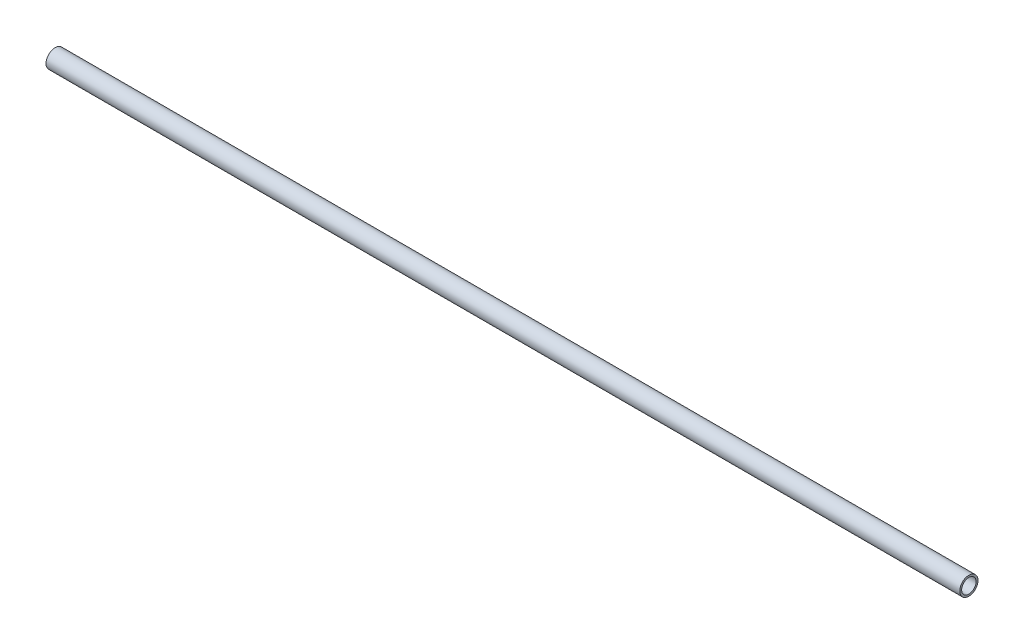
ISO-10303-21;
HEADER;
FILE_DESCRIPTION(('STEP AP214'),'2;1');
FILE_NAME('part.step','',(''),(''),'','','');
FILE_SCHEMA(('AUTOMOTIVE_DESIGN { 1 0 10303 214 1 1 1 1 }'));
ENDSEC;
DATA;
#1=APPLICATION_CONTEXT('core data for automotive mechanical design processes');
#2=APPLICATION_PROTOCOL_DEFINITION('international standard','automotive_design',2000,#1);
#3=PRODUCT_CONTEXT('',#1,'mechanical');
#4=PRODUCT('Part','Part','',(#3));
#5=PRODUCT_RELATED_PRODUCT_CATEGORY('part','',(#4));
#6=PRODUCT_DEFINITION_FORMATION('','',#4);
#7=PRODUCT_DEFINITION_CONTEXT('part definition',#1,'design');
#8=PRODUCT_DEFINITION('design','',#6,#7);
#9=PRODUCT_DEFINITION_SHAPE('','',#8);
#10=(LENGTH_UNIT() NAMED_UNIT(*) SI_UNIT(.MILLI.,.METRE.));
#11=(NAMED_UNIT(*) PLANE_ANGLE_UNIT() SI_UNIT($,.RADIAN.));
#12=(NAMED_UNIT(*) SI_UNIT($,.STERADIAN.) SOLID_ANGLE_UNIT());
#13=UNCERTAINTY_MEASURE_WITH_UNIT(LENGTH_MEASURE(1.E-05),#10,'distance_accuracy_value','');
#14=(GEOMETRIC_REPRESENTATION_CONTEXT(3) GLOBAL_UNCERTAINTY_ASSIGNED_CONTEXT((#13)) GLOBAL_UNIT_ASSIGNED_CONTEXT((#10,
#11,#12)) REPRESENTATION_CONTEXT('',''));
#15=CARTESIAN_POINT('',(0.,0.,0.));
#16=DIRECTION('',(0.,0.,1.));
#17=DIRECTION('',(1.,0.,0.));
#18=AXIS2_PLACEMENT_3D('',#15,#16,#17);
#19=CARTESIAN_POINT('',(1900.,0.,0.));
#20=DIRECTION('',(1.,0.,0.));
#21=DIRECTION('',(0.,0.,-1.));
#22=AXIS2_PLACEMENT_3D('',#19,#20,#21);
#23=PLANE('',#22);
#24=CARTESIAN_POINT('',(1900.,0.,0.));
#25=DIRECTION('',(1.,0.,0.));
#26=DIRECTION('',(0.,0.,-1.));
#27=AXIS2_PLACEMENT_3D('',#24,#25,#26);
#28=CIRCLE('',#27,19.);
#29=CARTESIAN_POINT('',(1900.,0.,19.));
#30=VERTEX_POINT('',#29);
#31=EDGE_CURVE('E10',#30,#30,#28,.T.);
#32=ORIENTED_EDGE('',*,*,#31,.T.);
#33=EDGE_LOOP('',(#32));
#34=FACE_BOUND('',#33,.T.);
#35=CARTESIAN_POINT('',(1900.,0.,0.));
#36=DIRECTION('',(1.,0.,0.));
#37=DIRECTION('',(0.,0.,-1.));
#38=AXIS2_PLACEMENT_3D('',#35,#36,#37);
#39=CIRCLE('',#38,15.);
#40=CARTESIAN_POINT('',(1900.,0.,15.));
#41=VERTEX_POINT('',#40);
#42=EDGE_CURVE('E41',#41,#41,#39,.T.);
#43=ORIENTED_EDGE('',*,*,#42,.F.);
#44=EDGE_LOOP('',(#43));
#45=FACE_BOUND('',#44,.T.);
#46=ADVANCED_FACE('F30',(#34,#45),#23,.T.);
#47=CARTESIAN_POINT('',(0.,0.,0.));
#48=DIRECTION('',(1.,0.,0.));
#49=DIRECTION('',(0.,0.,-1.));
#50=AXIS2_PLACEMENT_3D('',#47,#48,#49);
#51=PLANE('',#50);
#52=CARTESIAN_POINT('',(0.,0.,0.));
#53=DIRECTION('',(1.,0.,0.));
#54=DIRECTION('',(0.,0.,-1.));
#55=AXIS2_PLACEMENT_3D('',#52,#53,#54);
#56=CIRCLE('',#55,19.);
#57=CARTESIAN_POINT('',(-2.22044604925031E-13,0.,19.));
#58=VERTEX_POINT('',#57);
#59=EDGE_CURVE('E34',#58,#58,#56,.T.);
#60=ORIENTED_EDGE('',*,*,#59,.F.);
#61=EDGE_LOOP('',(#60));
#62=FACE_BOUND('',#61,.T.);
#63=CARTESIAN_POINT('',(0.,0.,0.));
#64=DIRECTION('',(1.,0.,0.));
#65=DIRECTION('',(0.,0.,-1.));
#66=AXIS2_PLACEMENT_3D('',#63,#64,#65);
#67=CIRCLE('',#66,15.);
#68=CARTESIAN_POINT('',(-2.22044604925031E-13,0.,15.));
#69=VERTEX_POINT('',#68);
#70=EDGE_CURVE('E43',#69,#69,#67,.T.);
#71=ORIENTED_EDGE('',*,*,#70,.T.);
#72=EDGE_LOOP('',(#71));
#73=FACE_BOUND('',#72,.T.);
#74=ADVANCED_FACE('F53',(#62,#73),#51,.F.);
#75=CARTESIAN_POINT('',(1900.,0.,0.));
#76=DIRECTION('',(-1.,0.,0.));
#77=DIRECTION('',(0.,0.,1.));
#78=AXIS2_PLACEMENT_3D('',#75,#76,#77);
#79=CYLINDRICAL_SURFACE('',#78,19.);
#80=CARTESIAN_POINT('',(1900.,0.,19.));
#81=CARTESIAN_POINT('',(1880.20833333333,0.,19.));
#82=CARTESIAN_POINT('',(1860.41666666667,0.,19.));
#83=CARTESIAN_POINT('',(1820.83333333333,0.,19.));
#84=CARTESIAN_POINT('',(1801.04166666667,0.,19.));
#85=CARTESIAN_POINT('',(1761.45833333333,0.,19.));
#86=CARTESIAN_POINT('',(1741.66666666667,0.,19.));
#87=CARTESIAN_POINT('',(1702.08333333333,0.,19.));
#88=CARTESIAN_POINT('',(1682.29166666667,0.,19.));
#89=CARTESIAN_POINT('',(1642.70833333333,0.,19.));
#90=CARTESIAN_POINT('',(1622.91666666667,0.,19.));
#91=CARTESIAN_POINT('',(1583.33333333333,0.,19.));
#92=CARTESIAN_POINT('',(1563.54166666667,0.,19.));
#93=CARTESIAN_POINT('',(1523.95833333333,0.,19.));
#94=CARTESIAN_POINT('',(1504.16666666667,0.,19.));
#95=CARTESIAN_POINT('',(1464.58333333333,0.,19.));
#96=CARTESIAN_POINT('',(1444.79166666667,0.,19.));
#97=CARTESIAN_POINT('',(1405.20833333333,0.,19.));
#98=CARTESIAN_POINT('',(1385.41666666667,0.,19.));
#99=CARTESIAN_POINT('',(1345.83333333333,0.,19.));
#100=CARTESIAN_POINT('',(1326.04166666667,0.,19.));
#101=CARTESIAN_POINT('',(1286.45833333333,0.,19.));
#102=CARTESIAN_POINT('',(1266.66666666667,0.,19.));
#103=CARTESIAN_POINT('',(1227.08333333333,0.,19.));
#104=CARTESIAN_POINT('',(1207.29166666667,0.,19.));
#105=CARTESIAN_POINT('',(1167.70833333333,0.,19.));
#106=CARTESIAN_POINT('',(1147.91666666667,0.,19.));
#107=CARTESIAN_POINT('',(1108.33333333333,0.,19.));
#108=CARTESIAN_POINT('',(1088.54166666667,0.,19.));
#109=CARTESIAN_POINT('',(1048.95833333333,0.,19.));
#110=CARTESIAN_POINT('',(1029.16666666667,0.,19.));
#111=CARTESIAN_POINT('',(989.583333333333,0.,19.));
#112=CARTESIAN_POINT('',(969.791666666666,0.,19.));
#113=CARTESIAN_POINT('',(930.208333333333,0.,19.));
#114=CARTESIAN_POINT('',(910.416666666667,0.,19.));
#115=CARTESIAN_POINT('',(870.833333333333,0.,19.));
#116=CARTESIAN_POINT('',(851.041666666667,0.,19.));
#117=CARTESIAN_POINT('',(811.458333333333,0.,19.));
#118=CARTESIAN_POINT('',(791.666666666667,0.,19.));
#119=CARTESIAN_POINT('',(752.083333333333,0.,19.));
#120=CARTESIAN_POINT('',(732.291666666667,0.,19.));
#121=CARTESIAN_POINT('',(692.708333333333,0.,19.));
#122=CARTESIAN_POINT('',(672.916666666667,0.,19.));
#123=CARTESIAN_POINT('',(633.333333333333,0.,19.));
#124=CARTESIAN_POINT('',(613.541666666667,0.,19.));
#125=CARTESIAN_POINT('',(573.958333333333,0.,19.));
#126=CARTESIAN_POINT('',(554.166666666667,0.,19.));
#127=CARTESIAN_POINT('',(514.583333333333,0.,19.));
#128=CARTESIAN_POINT('',(494.791666666667,0.,19.));
#129=CARTESIAN_POINT('',(455.208333333333,0.,19.));
#130=CARTESIAN_POINT('',(435.416666666667,0.,19.));
#131=CARTESIAN_POINT('',(395.833333333333,0.,19.));
#132=CARTESIAN_POINT('',(376.041666666667,0.,19.));
#133=CARTESIAN_POINT('',(336.458333333333,0.,19.));
#134=CARTESIAN_POINT('',(316.666666666666,0.,19.));
#135=CARTESIAN_POINT('',(277.083333333333,0.,19.));
#136=CARTESIAN_POINT('',(257.291666666666,0.,19.));
#137=CARTESIAN_POINT('',(217.708333333333,0.,19.));
#138=CARTESIAN_POINT('',(197.916666666667,0.,19.));
#139=CARTESIAN_POINT('',(158.333333333333,0.,19.));
#140=CARTESIAN_POINT('',(138.541666666666,0.,19.));
#141=CARTESIAN_POINT('',(98.958333333333,0.,19.));
#142=CARTESIAN_POINT('',(79.1666666666664,0.,19.));
#143=CARTESIAN_POINT('',(39.5833333333331,0.,19.));
#144=CARTESIAN_POINT('',(19.7916666666664,0.,19.));
#145=CARTESIAN_POINT('',(-2.22044604925031E-13,0.,19.));
#146=B_SPLINE_CURVE_WITH_KNOTS('',3,(#80,#81,#82,#83,#84,#85,#86,#87,#88,#89,#90,#91,#92,#93,
#94,#95,#96,#97,#98,#99,#100,#101,#102,#103,#104,#105,#106,#107,#108,#109,#110,#111,#112,#113,
#114,#115,#116,#117,#118,#119,#120,#121,#122,#123,#124,#125,#126,#127,#128,#129,#130,#131,#132,
#133,#134,#135,#136,#137,#138,#139,#140,#141,#142,#143,#144,#145),.UNSPECIFIED.,.F.,.F.,(4,2,2,
2,2,2,2,2,2,2,2,2,2,2,2,2,2,2,2,2,2,2,2,2,2,2,2,2,2,2,2,2,4),(0.,59.3750000000002,118.75,
178.125,237.5,296.875,356.25,415.625,475.,534.375,593.75,653.125,712.5,771.875,831.25,890.625,
950.,1009.375,1068.75,1128.125,1187.5,1246.875,1306.25,1365.625,1425.,1484.375,1543.75,1603.125,
1662.5,1721.875,1781.25,1840.625,1900.),.UNSPECIFIED.);
#147=EDGE_CURVE('BSEAM32',#30,#58,#146,.T.);
#148=ORIENTED_EDGE('',*,*,#31,.F.);
#149=ORIENTED_EDGE('',*,*,#59,.T.);
#150=ORIENTED_EDGE('',*,*,#147,.T.);
#151=ORIENTED_EDGE('',*,*,#147,.F.);
#152=EDGE_LOOP('',(#148,#150,#149,#151));
#153=FACE_BOUND('',#152,.T.);
#154=ADVANCED_FACE('F32',(#153),#79,.T.);
#155=CARTESIAN_POINT('',(1900.,0.,0.));
#156=DIRECTION('',(-1.,0.,0.));
#157=DIRECTION('',(0.,0.,1.));
#158=AXIS2_PLACEMENT_3D('',#155,#156,#157);
#159=CYLINDRICAL_SURFACE('',#158,15.);
#160=CARTESIAN_POINT('',(1900.,0.,15.));
#161=CARTESIAN_POINT('',(1880.20833333333,0.,15.));
#162=CARTESIAN_POINT('',(1860.41666666667,0.,15.));
#163=CARTESIAN_POINT('',(1820.83333333333,0.,15.));
#164=CARTESIAN_POINT('',(1801.04166666667,0.,15.));
#165=CARTESIAN_POINT('',(1761.45833333333,0.,15.));
#166=CARTESIAN_POINT('',(1741.66666666667,0.,15.));
#167=CARTESIAN_POINT('',(1702.08333333333,0.,15.));
#168=CARTESIAN_POINT('',(1682.29166666667,0.,15.));
#169=CARTESIAN_POINT('',(1642.70833333333,0.,15.));
#170=CARTESIAN_POINT('',(1622.91666666667,0.,15.));
#171=CARTESIAN_POINT('',(1583.33333333333,0.,15.));
#172=CARTESIAN_POINT('',(1563.54166666667,0.,15.));
#173=CARTESIAN_POINT('',(1523.95833333333,0.,15.));
#174=CARTESIAN_POINT('',(1504.16666666667,0.,15.));
#175=CARTESIAN_POINT('',(1464.58333333333,0.,15.));
#176=CARTESIAN_POINT('',(1444.79166666667,0.,15.));
#177=CARTESIAN_POINT('',(1405.20833333333,0.,15.));
#178=CARTESIAN_POINT('',(1385.41666666667,0.,15.));
#179=CARTESIAN_POINT('',(1345.83333333333,0.,15.));
#180=CARTESIAN_POINT('',(1326.04166666667,0.,15.));
#181=CARTESIAN_POINT('',(1286.45833333333,0.,15.));
#182=CARTESIAN_POINT('',(1266.66666666667,0.,15.));
#183=CARTESIAN_POINT('',(1227.08333333333,0.,15.));
#184=CARTESIAN_POINT('',(1207.29166666667,0.,15.));
#185=CARTESIAN_POINT('',(1167.70833333333,0.,15.));
#186=CARTESIAN_POINT('',(1147.91666666667,0.,15.));
#187=CARTESIAN_POINT('',(1108.33333333333,0.,15.));
#188=CARTESIAN_POINT('',(1088.54166666667,0.,15.));
#189=CARTESIAN_POINT('',(1048.95833333333,0.,15.));
#190=CARTESIAN_POINT('',(1029.16666666667,0.,15.));
#191=CARTESIAN_POINT('',(989.583333333333,0.,15.));
#192=CARTESIAN_POINT('',(969.791666666666,0.,15.));
#193=CARTESIAN_POINT('',(930.208333333333,0.,15.));
#194=CARTESIAN_POINT('',(910.416666666667,0.,15.));
#195=CARTESIAN_POINT('',(870.833333333333,0.,15.));
#196=CARTESIAN_POINT('',(851.041666666667,0.,15.));
#197=CARTESIAN_POINT('',(811.458333333333,0.,15.));
#198=CARTESIAN_POINT('',(791.666666666667,0.,15.));
#199=CARTESIAN_POINT('',(752.083333333333,0.,15.));
#200=CARTESIAN_POINT('',(732.291666666667,0.,15.));
#201=CARTESIAN_POINT('',(692.708333333333,0.,15.));
#202=CARTESIAN_POINT('',(672.916666666667,0.,15.));
#203=CARTESIAN_POINT('',(633.333333333333,0.,15.));
#204=CARTESIAN_POINT('',(613.541666666667,0.,15.));
#205=CARTESIAN_POINT('',(573.958333333333,0.,15.));
#206=CARTESIAN_POINT('',(554.166666666667,0.,15.));
#207=CARTESIAN_POINT('',(514.583333333333,0.,15.));
#208=CARTESIAN_POINT('',(494.791666666667,0.,15.));
#209=CARTESIAN_POINT('',(455.208333333333,0.,15.));
#210=CARTESIAN_POINT('',(435.416666666667,0.,15.));
#211=CARTESIAN_POINT('',(395.833333333333,0.,15.));
#212=CARTESIAN_POINT('',(376.041666666667,0.,15.));
#213=CARTESIAN_POINT('',(336.458333333333,0.,15.));
#214=CARTESIAN_POINT('',(316.666666666666,0.,15.));
#215=CARTESIAN_POINT('',(277.083333333333,0.,15.));
#216=CARTESIAN_POINT('',(257.291666666666,0.,15.));
#217=CARTESIAN_POINT('',(217.708333333333,0.,15.));
#218=CARTESIAN_POINT('',(197.916666666667,0.,15.));
#219=CARTESIAN_POINT('',(158.333333333333,0.,15.));
#220=CARTESIAN_POINT('',(138.541666666666,0.,15.));
#221=CARTESIAN_POINT('',(98.958333333333,0.,15.));
#222=CARTESIAN_POINT('',(79.1666666666664,0.,15.));
#223=CARTESIAN_POINT('',(39.5833333333331,0.,15.));
#224=CARTESIAN_POINT('',(19.7916666666664,0.,15.));
#225=CARTESIAN_POINT('',(-2.22044604925031E-13,0.,15.));
#226=B_SPLINE_CURVE_WITH_KNOTS('',3,(#160,#161,#162,#163,#164,#165,#166,#167,#168,#169,#170,
#171,#172,#173,#174,#175,#176,#177,#178,#179,#180,#181,#182,#183,#184,#185,#186,#187,#188,#189,
#190,#191,#192,#193,#194,#195,#196,#197,#198,#199,#200,#201,#202,#203,#204,#205,#206,#207,#208,
#209,#210,#211,#212,#213,#214,#215,#216,#217,#218,#219,#220,#221,#222,#223,#224,#225),
.UNSPECIFIED.,.F.,.F.,(4,2,2,2,2,2,2,2,2,2,2,2,2,2,2,2,2,2,2,2,2,2,2,2,2,2,2,2,2,2,2,2,4),(0.,
59.3750000000002,118.75,178.125,237.5,296.875,356.25,415.625,475.,534.375,593.75,653.125,712.5,
771.875,831.25,890.625,950.,1009.375,1068.75,1128.125,1187.5,1246.875,1306.25,1365.625,1425.,
1484.375,1543.75,1603.125,1662.5,1721.875,1781.25,1840.625,1900.),.UNSPECIFIED.);
#227=EDGE_CURVE('BSEAM49',#41,#69,#226,.T.);
#228=ORIENTED_EDGE('',*,*,#42,.T.);
#229=ORIENTED_EDGE('',*,*,#70,.F.);
#230=ORIENTED_EDGE('',*,*,#227,.T.);
#231=ORIENTED_EDGE('',*,*,#227,.F.);
#232=EDGE_LOOP('',(#228,#230,#229,#231));
#233=FACE_BOUND('',#232,.T.);
#234=ADVANCED_FACE('F49',(#233),#159,.F.);
#235=CLOSED_SHELL('',(#46,#74,#154,#234));
#236=MANIFOLD_SOLID_BREP('B2',#235);
#237=ADVANCED_BREP_SHAPE_REPRESENTATION('',(#18,#236),#14);
#238=SHAPE_DEFINITION_REPRESENTATION(#9,#237);
ENDSEC;
END-ISO-10303-21;
